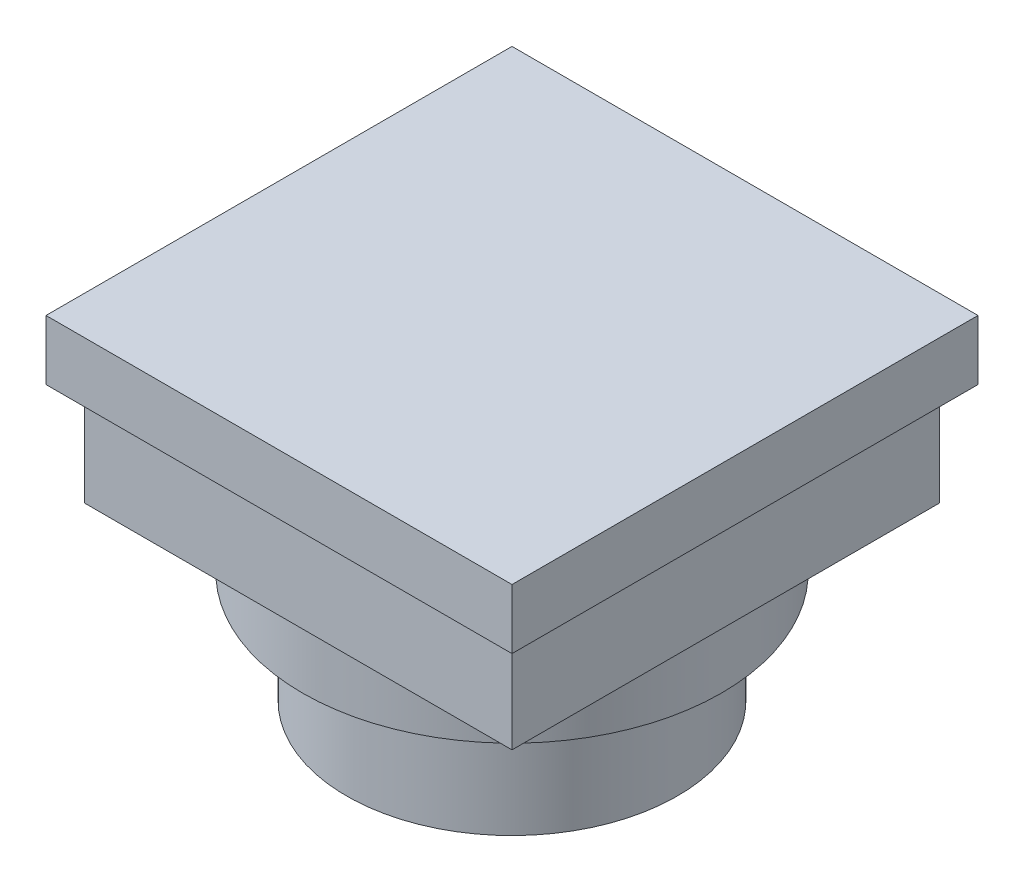
ISO-10303-21;
HEADER;
FILE_DESCRIPTION(('STEP AP214'),'2;1');
FILE_NAME('part.step','',(''),(''),'','','');
FILE_SCHEMA(('AUTOMOTIVE_DESIGN { 1 0 10303 214 1 1 1 1 }'));
ENDSEC;
DATA;
#1=APPLICATION_CONTEXT('core data for automotive mechanical design processes');
#2=APPLICATION_PROTOCOL_DEFINITION('international standard','automotive_design',2000,#1);
#3=PRODUCT_CONTEXT('',#1,'mechanical');
#4=PRODUCT('Part','Part','',(#3));
#5=PRODUCT_RELATED_PRODUCT_CATEGORY('part','',(#4));
#6=PRODUCT_DEFINITION_FORMATION('','',#4);
#7=PRODUCT_DEFINITION_CONTEXT('part definition',#1,'design');
#8=PRODUCT_DEFINITION('design','',#6,#7);
#9=PRODUCT_DEFINITION_SHAPE('','',#8);
#10=(LENGTH_UNIT() NAMED_UNIT(*) SI_UNIT(.MILLI.,.METRE.));
#11=(NAMED_UNIT(*) PLANE_ANGLE_UNIT() SI_UNIT($,.RADIAN.));
#12=(NAMED_UNIT(*) SI_UNIT($,.STERADIAN.) SOLID_ANGLE_UNIT());
#13=UNCERTAINTY_MEASURE_WITH_UNIT(LENGTH_MEASURE(1.E-05),#10,'distance_accuracy_value','');
#14=(GEOMETRIC_REPRESENTATION_CONTEXT(3) GLOBAL_UNCERTAINTY_ASSIGNED_CONTEXT((#13)) GLOBAL_UNIT_ASSIGNED_CONTEXT((#10,
#11,#12)) REPRESENTATION_CONTEXT('',''));
#15=CARTESIAN_POINT('',(0.,0.,0.));
#16=DIRECTION('',(0.,0.,1.));
#17=DIRECTION('',(1.,0.,0.));
#18=AXIS2_PLACEMENT_3D('',#15,#16,#17);
#19=CARTESIAN_POINT('',(2.725,0.7,2.725));
#20=DIRECTION('',(-1.,0.,0.));
#21=DIRECTION('',(0.,0.,1.));
#22=AXIS2_PLACEMENT_3D('',#19,#20,#21);
#23=PLANE('',#22);
#24=DIRECTION('',(0.,0.,-1.));
#25=VECTOR('',#24,1.);
#26=CARTESIAN_POINT('',(2.725,0.,2.725));
#27=LINE('',#26,#25);
#28=CARTESIAN_POINT('',(2.725,0.,2.725));
#29=VERTEX_POINT('',#28);
#30=CARTESIAN_POINT('',(2.725,0.,-2.725));
#31=VERTEX_POINT('',#30);
#32=EDGE_CURVE('E123',#29,#31,#27,.T.);
#33=ORIENTED_EDGE('',*,*,#32,.T.);
#34=DIRECTION('',(0.,-1.,0.));
#35=VECTOR('',#34,1.);
#36=CARTESIAN_POINT('',(2.725,0.7,-2.725));
#37=LINE('',#36,#35);
#38=CARTESIAN_POINT('',(2.725,0.7,-2.725));
#39=VERTEX_POINT('',#38);
#40=EDGE_CURVE('E40',#39,#31,#37,.T.);
#41=ORIENTED_EDGE('',*,*,#40,.F.);
#42=DIRECTION('',(0.,0.,-1.));
#43=VECTOR('',#42,1.);
#44=CARTESIAN_POINT('',(2.725,0.7,2.725));
#45=LINE('',#44,#43);
#46=CARTESIAN_POINT('',(2.725,0.7,2.725));
#47=VERTEX_POINT('',#46);
#48=EDGE_CURVE('E132',#47,#39,#45,.T.);
#49=ORIENTED_EDGE('',*,*,#48,.F.);
#50=DIRECTION('',(0.,-1.,0.));
#51=VECTOR('',#50,1.);
#52=CARTESIAN_POINT('',(2.725,0.7,2.725));
#53=LINE('',#52,#51);
#54=EDGE_CURVE('E141',#47,#29,#53,.T.);
#55=ORIENTED_EDGE('',*,*,#54,.T.);
#56=EDGE_LOOP('',(#33,#41,#49,#55));
#57=FACE_BOUND('',#56,.T.);
#58=ADVANCED_FACE('F37',(#57),#23,.F.);
#59=CARTESIAN_POINT('',(-2.725,0.7,-2.725));
#60=DIRECTION('',(0.,0.,1.));
#61=DIRECTION('',(1.,0.,0.));
#62=AXIS2_PLACEMENT_3D('',#59,#60,#61);
#63=PLANE('',#62);
#64=DIRECTION('',(-1.,0.,0.));
#65=VECTOR('',#64,1.);
#66=CARTESIAN_POINT('',(-2.725,0.,-2.725));
#67=LINE('',#66,#65);
#68=CARTESIAN_POINT('',(-2.725,0.,-2.725));
#69=VERTEX_POINT('',#68);
#70=EDGE_CURVE('E126',#31,#69,#67,.T.);
#71=ORIENTED_EDGE('',*,*,#70,.T.);
#72=DIRECTION('',(0.,-1.,0.));
#73=VECTOR('',#72,1.);
#74=CARTESIAN_POINT('',(-2.725,0.7,-2.725));
#75=LINE('',#74,#73);
#76=CARTESIAN_POINT('',(-2.725,0.7,-2.725));
#77=VERTEX_POINT('',#76);
#78=EDGE_CURVE('E151',#77,#69,#75,.T.);
#79=ORIENTED_EDGE('',*,*,#78,.F.);
#80=DIRECTION('',(-1.,0.,0.));
#81=VECTOR('',#80,1.);
#82=CARTESIAN_POINT('',(-2.725,0.7,-2.725));
#83=LINE('',#82,#81);
#84=EDGE_CURVE('E135',#39,#77,#83,.T.);
#85=ORIENTED_EDGE('',*,*,#84,.F.);
#86=ORIENTED_EDGE('',*,*,#40,.T.);
#87=EDGE_LOOP('',(#71,#79,#85,#86));
#88=FACE_BOUND('',#87,.T.);
#89=ADVANCED_FACE('F198',(#88),#63,.F.);
#90=CARTESIAN_POINT('',(-2.725,0.7,2.725));
#91=DIRECTION('',(1.,0.,0.));
#92=DIRECTION('',(0.,0.,-1.));
#93=AXIS2_PLACEMENT_3D('',#90,#91,#92);
#94=PLANE('',#93);
#95=DIRECTION('',(0.,0.,1.));
#96=VECTOR('',#95,1.);
#97=CARTESIAN_POINT('',(-2.725,0.,2.725));
#98=LINE('',#97,#96);
#99=CARTESIAN_POINT('',(-2.725,0.,2.725));
#100=VERTEX_POINT('',#99);
#101=EDGE_CURVE('E144',#69,#100,#98,.T.);
#102=ORIENTED_EDGE('',*,*,#101,.T.);
#103=DIRECTION('',(0.,-1.,0.));
#104=VECTOR('',#103,1.);
#105=CARTESIAN_POINT('',(-2.725,0.7,2.725));
#106=LINE('',#105,#104);
#107=CARTESIAN_POINT('',(-2.725,0.7,2.725));
#108=VERTEX_POINT('',#107);
#109=EDGE_CURVE('E149',#108,#100,#106,.T.);
#110=ORIENTED_EDGE('',*,*,#109,.F.);
#111=DIRECTION('',(0.,0.,1.));
#112=VECTOR('',#111,1.);
#113=CARTESIAN_POINT('',(-2.725,0.7,2.725));
#114=LINE('',#113,#112);
#115=EDGE_CURVE('E138',#77,#108,#114,.T.);
#116=ORIENTED_EDGE('',*,*,#115,.F.);
#117=ORIENTED_EDGE('',*,*,#78,.T.);
#118=EDGE_LOOP('',(#102,#110,#116,#117));
#119=FACE_BOUND('',#118,.T.);
#120=ADVANCED_FACE('F196',(#119),#94,.F.);
#121=CARTESIAN_POINT('',(-2.725,0.7,2.725));
#122=DIRECTION('',(0.,0.,-1.));
#123=DIRECTION('',(-1.,0.,0.));
#124=AXIS2_PLACEMENT_3D('',#121,#122,#123);
#125=PLANE('',#124);
#126=DIRECTION('',(1.,0.,0.));
#127=VECTOR('',#126,1.);
#128=CARTESIAN_POINT('',(-2.725,0.,2.725));
#129=LINE('',#128,#127);
#130=EDGE_CURVE('E136',#100,#29,#129,.T.);
#131=ORIENTED_EDGE('',*,*,#130,.T.);
#132=ORIENTED_EDGE('',*,*,#54,.F.);
#133=DIRECTION('',(1.,0.,0.));
#134=VECTOR('',#133,1.);
#135=CARTESIAN_POINT('',(-2.725,0.7,2.725));
#136=LINE('',#135,#134);
#137=EDGE_CURVE('E140',#108,#47,#136,.T.);
#138=ORIENTED_EDGE('',*,*,#137,.F.);
#139=ORIENTED_EDGE('',*,*,#109,.T.);
#140=EDGE_LOOP('',(#131,#132,#138,#139));
#141=FACE_BOUND('',#140,.T.);
#142=ADVANCED_FACE('F194',(#141),#125,.F.);
#143=CARTESIAN_POINT('',(0.,0.7,0.));
#144=DIRECTION('',(0.,-1.,0.));
#145=DIRECTION('',(0.,0.,-1.));
#146=AXIS2_PLACEMENT_3D('',#143,#144,#145);
#147=PLANE('',#146);
#148=ORIENTED_EDGE('',*,*,#48,.T.);
#149=ORIENTED_EDGE('',*,*,#84,.T.);
#150=ORIENTED_EDGE('',*,*,#115,.T.);
#151=ORIENTED_EDGE('',*,*,#137,.T.);
#152=EDGE_LOOP('',(#148,#149,#150,#151));
#153=FACE_BOUND('',#152,.T.);
#154=ADVANCED_FACE('F185',(#153),#147,.F.);
#155=CARTESIAN_POINT('',(0.,0.,0.));
#156=DIRECTION('',(0.,-1.,0.));
#157=DIRECTION('',(0.,0.,-1.));
#158=AXIS2_PLACEMENT_3D('',#155,#156,#157);
#159=PLANE('',#158);
#160=DIRECTION('',(0.,0.,1.));
#161=VECTOR('',#160,1.);
#162=CARTESIAN_POINT('',(2.5,0.,-2.5));
#163=LINE('',#162,#161);
#164=CARTESIAN_POINT('',(2.5,0.,-2.5));
#165=VERTEX_POINT('',#164);
#166=CARTESIAN_POINT('',(2.5,0.,2.5));
#167=VERTEX_POINT('',#166);
#168=EDGE_CURVE('E53',#165,#167,#163,.T.);
#169=ORIENTED_EDGE('',*,*,#168,.F.);
#170=DIRECTION('',(1.,0.,0.));
#171=VECTOR('',#170,1.);
#172=CARTESIAN_POINT('',(-2.5,0.,-2.5));
#173=LINE('',#172,#171);
#174=CARTESIAN_POINT('',(-2.5,0.,-2.5));
#175=VERTEX_POINT('',#174);
#176=EDGE_CURVE('E57',#175,#165,#173,.T.);
#177=ORIENTED_EDGE('',*,*,#176,.F.);
#178=DIRECTION('',(0.,0.,-1.));
#179=VECTOR('',#178,1.);
#180=CARTESIAN_POINT('',(-2.5,0.,-2.5));
#181=LINE('',#180,#179);
#182=CARTESIAN_POINT('',(-2.5,0.,2.5));
#183=VERTEX_POINT('',#182);
#184=EDGE_CURVE('E173',#183,#175,#181,.T.);
#185=ORIENTED_EDGE('',*,*,#184,.F.);
#186=DIRECTION('',(-1.,0.,0.));
#187=VECTOR('',#186,1.);
#188=CARTESIAN_POINT('',(-2.5,0.,2.5));
#189=LINE('',#188,#187);
#190=EDGE_CURVE('E171',#167,#183,#189,.T.);
#191=ORIENTED_EDGE('',*,*,#190,.F.);
#192=EDGE_LOOP('',(#169,#177,#185,#191));
#193=FACE_BOUND('',#192,.T.);
#194=ORIENTED_EDGE('',*,*,#32,.F.);
#195=ORIENTED_EDGE('',*,*,#130,.F.);
#196=ORIENTED_EDGE('',*,*,#101,.F.);
#197=ORIENTED_EDGE('',*,*,#70,.F.);
#198=EDGE_LOOP('',(#194,#195,#196,#197));
#199=FACE_BOUND('',#198,.T.);
#200=ADVANCED_FACE('F182',(#193,#199),#159,.T.);
#201=CARTESIAN_POINT('',(2.5,-1.2,-2.5));
#202=DIRECTION('',(-1.,0.,0.));
#203=DIRECTION('',(0.,0.,1.));
#204=AXIS2_PLACEMENT_3D('',#201,#202,#203);
#205=PLANE('',#204);
#206=ORIENTED_EDGE('',*,*,#168,.T.);
#207=DIRECTION('',(0.,1.,0.));
#208=VECTOR('',#207,1.);
#209=CARTESIAN_POINT('',(2.5,-1.2,2.5));
#210=LINE('',#209,#208);
#211=CARTESIAN_POINT('',(2.5,-1.2,2.5));
#212=VERTEX_POINT('',#211);
#213=EDGE_CURVE('E106',#212,#167,#210,.T.);
#214=ORIENTED_EDGE('',*,*,#213,.F.);
#215=DIRECTION('',(0.,0.,1.));
#216=VECTOR('',#215,1.);
#217=CARTESIAN_POINT('',(2.5,-1.2,-2.5));
#218=LINE('',#217,#216);
#219=CARTESIAN_POINT('',(2.5,-1.2,-2.5));
#220=VERTEX_POINT('',#219);
#221=EDGE_CURVE('E112',#220,#212,#218,.T.);
#222=ORIENTED_EDGE('',*,*,#221,.F.);
#223=DIRECTION('',(0.,1.,0.));
#224=VECTOR('',#223,1.);
#225=CARTESIAN_POINT('',(2.5,-1.2,-2.5));
#226=LINE('',#225,#224);
#227=EDGE_CURVE('E169',#220,#165,#226,.T.);
#228=ORIENTED_EDGE('',*,*,#227,.T.);
#229=EDGE_LOOP('',(#206,#214,#222,#228));
#230=FACE_BOUND('',#229,.T.);
#231=ADVANCED_FACE('F122',(#230),#205,.F.);
#232=CARTESIAN_POINT('',(-2.5,-1.2,2.5));
#233=DIRECTION('',(0.,0.,-1.));
#234=DIRECTION('',(-1.,0.,0.));
#235=AXIS2_PLACEMENT_3D('',#232,#233,#234);
#236=PLANE('',#235);
#237=ORIENTED_EDGE('',*,*,#190,.T.);
#238=DIRECTION('',(0.,1.,0.));
#239=VECTOR('',#238,1.);
#240=CARTESIAN_POINT('',(-2.5,-1.2,2.5));
#241=LINE('',#240,#239);
#242=CARTESIAN_POINT('',(-2.5,-1.2,2.5));
#243=VERTEX_POINT('',#242);
#244=EDGE_CURVE('E108',#243,#183,#241,.T.);
#245=ORIENTED_EDGE('',*,*,#244,.F.);
#246=DIRECTION('',(-1.,0.,0.));
#247=VECTOR('',#246,1.);
#248=CARTESIAN_POINT('',(-2.5,-1.2,2.5));
#249=LINE('',#248,#247);
#250=EDGE_CURVE('E101',#212,#243,#249,.T.);
#251=ORIENTED_EDGE('',*,*,#250,.F.);
#252=ORIENTED_EDGE('',*,*,#213,.T.);
#253=EDGE_LOOP('',(#237,#245,#251,#252));
#254=FACE_BOUND('',#253,.T.);
#255=ADVANCED_FACE('F104',(#254),#236,.F.);
#256=CARTESIAN_POINT('',(-2.5,-1.2,-2.5));
#257=DIRECTION('',(1.,0.,0.));
#258=DIRECTION('',(0.,0.,-1.));
#259=AXIS2_PLACEMENT_3D('',#256,#257,#258);
#260=PLANE('',#259);
#261=ORIENTED_EDGE('',*,*,#184,.T.);
#262=DIRECTION('',(0.,1.,0.));
#263=VECTOR('',#262,1.);
#264=CARTESIAN_POINT('',(-2.5,-1.2,-2.5));
#265=LINE('',#264,#263);
#266=CARTESIAN_POINT('',(-2.5,-1.2,-2.5));
#267=VERTEX_POINT('',#266);
#268=EDGE_CURVE('E128',#267,#175,#265,.T.);
#269=ORIENTED_EDGE('',*,*,#268,.F.);
#270=DIRECTION('',(0.,0.,-1.));
#271=VECTOR('',#270,1.);
#272=CARTESIAN_POINT('',(-2.5,-1.2,-2.5));
#273=LINE('',#272,#271);
#274=EDGE_CURVE('E111',#243,#267,#273,.T.);
#275=ORIENTED_EDGE('',*,*,#274,.F.);
#276=ORIENTED_EDGE('',*,*,#244,.T.);
#277=EDGE_LOOP('',(#261,#269,#275,#276));
#278=FACE_BOUND('',#277,.T.);
#279=ADVANCED_FACE('F181',(#278),#260,.F.);
#280=CARTESIAN_POINT('',(-2.5,-1.2,-2.5));
#281=DIRECTION('',(0.,0.,1.));
#282=DIRECTION('',(1.,0.,0.));
#283=AXIS2_PLACEMENT_3D('',#280,#281,#282);
#284=PLANE('',#283);
#285=ORIENTED_EDGE('',*,*,#176,.T.);
#286=ORIENTED_EDGE('',*,*,#227,.F.);
#287=DIRECTION('',(1.,0.,0.));
#288=VECTOR('',#287,1.);
#289=CARTESIAN_POINT('',(-2.5,-1.2,-2.5));
#290=LINE('',#289,#288);
#291=EDGE_CURVE('E117',#267,#220,#290,.T.);
#292=ORIENTED_EDGE('',*,*,#291,.F.);
#293=ORIENTED_EDGE('',*,*,#268,.T.);
#294=EDGE_LOOP('',(#285,#286,#292,#293));
#295=FACE_BOUND('',#294,.T.);
#296=ADVANCED_FACE('F179',(#295),#284,.F.);
#297=CARTESIAN_POINT('',(0.,-1.2,0.));
#298=DIRECTION('',(0.,1.,0.));
#299=DIRECTION('',(0.,0.,1.));
#300=AXIS2_PLACEMENT_3D('',#297,#298,#299);
#301=PLANE('',#300);
#302=CARTESIAN_POINT('',(0.,-1.2,0.));
#303=DIRECTION('',(0.,-1.,0.));
#304=DIRECTION('',(0.,0.,-1.));
#305=AXIS2_PLACEMENT_3D('',#302,#303,#304);
#306=CIRCLE('',#305,2.45);
#307=CARTESIAN_POINT('',(0.,-1.2,-2.45));
#308=VERTEX_POINT('',#307);
#309=EDGE_CURVE('E45',#308,#308,#306,.T.);
#310=ORIENTED_EDGE('',*,*,#309,.F.);
#311=EDGE_LOOP('',(#310));
#312=FACE_BOUND('',#311,.T.);
#313=ORIENTED_EDGE('',*,*,#221,.T.);
#314=ORIENTED_EDGE('',*,*,#250,.T.);
#315=ORIENTED_EDGE('',*,*,#274,.T.);
#316=ORIENTED_EDGE('',*,*,#291,.T.);
#317=EDGE_LOOP('',(#313,#314,#315,#316));
#318=FACE_BOUND('',#317,.T.);
#319=ADVANCED_FACE('F115',(#312,#318),#301,.F.);
#320=CARTESIAN_POINT('',(0.,-1.9,0.));
#321=DIRECTION('',(0.,1.,0.));
#322=DIRECTION('',(0.,0.,1.));
#323=AXIS2_PLACEMENT_3D('',#320,#321,#322);
#324=CYLINDRICAL_SURFACE('',#323,2.45);
#325=CARTESIAN_POINT('',(0.,-1.9,0.));
#326=DIRECTION('',(0.,-1.,0.));
#327=DIRECTION('',(0.,0.,-1.));
#328=AXIS2_PLACEMENT_3D('',#325,#326,#327);
#329=CIRCLE('',#328,2.45);
#330=CARTESIAN_POINT('',(0.,-1.9,-2.45));
#331=VERTEX_POINT('',#330);
#332=EDGE_CURVE('E165',#331,#331,#329,.T.);
#333=ORIENTED_EDGE('',*,*,#332,.F.);
#334=EDGE_LOOP('',(#333));
#335=FACE_BOUND('',#334,.T.);
#336=ORIENTED_EDGE('',*,*,#309,.T.);
#337=EDGE_LOOP('',(#336));
#338=FACE_BOUND('',#337,.T.);
#339=ADVANCED_FACE('F220',(#335,#338),#324,.T.);
#340=CARTESIAN_POINT('',(0.,-1.9,0.));
#341=DIRECTION('',(0.,-1.,0.));
#342=DIRECTION('',(0.,0.,-1.));
#343=AXIS2_PLACEMENT_3D('',#340,#341,#342);
#344=PLANE('',#343);
#345=CARTESIAN_POINT('',(0.,-1.9,0.));
#346=DIRECTION('',(0.,-1.,0.));
#347=DIRECTION('',(0.,0.,-1.));
#348=AXIS2_PLACEMENT_3D('',#345,#346,#347);
#349=CIRCLE('',#348,1.935);
#350=CARTESIAN_POINT('',(0.,-1.9,-1.935));
#351=VERTEX_POINT('',#350);
#352=EDGE_CURVE('E11',#351,#351,#349,.T.);
#353=ORIENTED_EDGE('',*,*,#352,.F.);
#354=EDGE_LOOP('',(#353));
#355=FACE_BOUND('',#354,.T.);
#356=ORIENTED_EDGE('',*,*,#332,.T.);
#357=EDGE_LOOP('',(#356));
#358=FACE_BOUND('',#357,.T.);
#359=ADVANCED_FACE('F224',(#355,#358),#344,.T.);
#360=CARTESIAN_POINT('',(0.,-3.2,0.));
#361=DIRECTION('',(0.,-1.,0.));
#362=DIRECTION('',(0.,0.,-1.));
#363=AXIS2_PLACEMENT_3D('',#360,#361,#362);
#364=PLANE('',#363);
#365=CARTESIAN_POINT('',(0.,-3.2,0.));
#366=DIRECTION('',(0.,-1.,0.));
#367=DIRECTION('',(0.,0.,-1.));
#368=AXIS2_PLACEMENT_3D('',#365,#366,#367);
#369=CIRCLE('',#368,1.935);
#370=CARTESIAN_POINT('',(0.,-3.2,-1.935));
#371=VERTEX_POINT('',#370);
#372=EDGE_CURVE('E253',#371,#371,#369,.T.);
#373=ORIENTED_EDGE('',*,*,#372,.T.);
#374=EDGE_LOOP('',(#373));
#375=FACE_BOUND('',#374,.T.);
#376=CARTESIAN_POINT('',(0.,-3.2,0.));
#377=DIRECTION('',(0.,-1.,0.));
#378=DIRECTION('',(0.,0.,-1.));
#379=AXIS2_PLACEMENT_3D('',#376,#377,#378);
#380=CIRCLE('',#379,0.35);
#381=CARTESIAN_POINT('',(0.,-3.2,-0.35));
#382=VERTEX_POINT('',#381);
#383=EDGE_CURVE('E248',#382,#382,#380,.T.);
#384=ORIENTED_EDGE('',*,*,#383,.F.);
#385=EDGE_LOOP('',(#384));
#386=FACE_BOUND('',#385,.T.);
#387=ADVANCED_FACE('F228',(#375,#386),#364,.T.);
#388=CARTESIAN_POINT('',(0.,-3.2,0.));
#389=DIRECTION('',(0.,1.,0.));
#390=DIRECTION('',(0.,0.,1.));
#391=AXIS2_PLACEMENT_3D('',#388,#389,#390);
#392=CYLINDRICAL_SURFACE('',#391,1.935);
#393=ORIENTED_EDGE('',*,*,#372,.F.);
#394=EDGE_LOOP('',(#393));
#395=FACE_BOUND('',#394,.T.);
#396=ORIENTED_EDGE('',*,*,#352,.T.);
#397=EDGE_LOOP('',(#396));
#398=FACE_BOUND('',#397,.T.);
#399=ADVANCED_FACE('F231',(#395,#398),#392,.T.);
#400=CARTESIAN_POINT('',(0.,-3.2,0.));
#401=DIRECTION('',(0.,1.,0.));
#402=DIRECTION('',(0.,0.,1.));
#403=AXIS2_PLACEMENT_3D('',#400,#401,#402);
#404=CYLINDRICAL_SURFACE('',#403,0.35);
#405=ORIENTED_EDGE('',*,*,#383,.T.);
#406=EDGE_LOOP('',(#405));
#407=FACE_BOUND('',#406,.T.);
#408=CARTESIAN_POINT('',(0.,-1.9,0.));
#409=DIRECTION('',(0.,-1.,0.));
#410=DIRECTION('',(0.,0.,-1.));
#411=AXIS2_PLACEMENT_3D('',#408,#409,#410);
#412=CIRCLE('',#411,0.35);
#413=CARTESIAN_POINT('',(0.,-1.9,-0.35));
#414=VERTEX_POINT('',#413);
#415=EDGE_CURVE('E251',#414,#414,#412,.T.);
#416=ORIENTED_EDGE('',*,*,#415,.F.);
#417=EDGE_LOOP('',(#416));
#418=FACE_BOUND('',#417,.T.);
#419=ADVANCED_FACE('F234',(#407,#418),#404,.F.);
#420=ORIENTED_EDGE('',*,*,#415,.T.);
#421=EDGE_LOOP('',(#420));
#422=FACE_BOUND('',#421,.T.);
#423=ADVANCED_FACE('F230',(#422),#344,.T.);
#424=CLOSED_SHELL('',(#58,#89,#120,#142,#154,#200,#231,#255,#279,#296,#319,#339,#359,#387,#399,
#419,#423));
#425=MANIFOLD_SOLID_BREP('B2',#424);
#426=ADVANCED_BREP_SHAPE_REPRESENTATION('',(#18,#425),#14);
#427=SHAPE_DEFINITION_REPRESENTATION(#9,#426);
ENDSEC;
END-ISO-10303-21;
